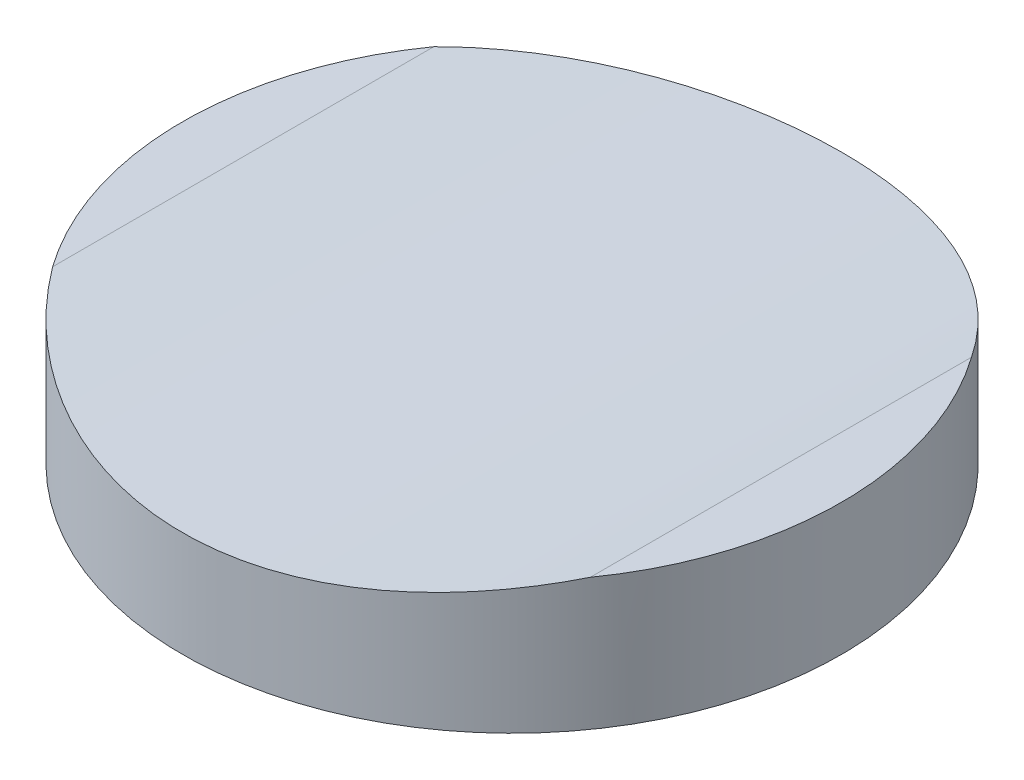
ISO-10303-21;
HEADER;
FILE_DESCRIPTION(('STEP AP214'),'2;1');
FILE_NAME('part.step','',(''),(''),'','','');
FILE_SCHEMA(('AUTOMOTIVE_DESIGN { 1 0 10303 214 1 1 1 1 }'));
ENDSEC;
DATA;
#1=APPLICATION_CONTEXT('core data for automotive mechanical design processes');
#2=APPLICATION_PROTOCOL_DEFINITION('international standard','automotive_design',2000,#1);
#3=PRODUCT_CONTEXT('',#1,'mechanical');
#4=PRODUCT('Part','Part','',(#3));
#5=PRODUCT_RELATED_PRODUCT_CATEGORY('part','',(#4));
#6=PRODUCT_DEFINITION_FORMATION('','',#4);
#7=PRODUCT_DEFINITION_CONTEXT('part definition',#1,'design');
#8=PRODUCT_DEFINITION('design','',#6,#7);
#9=PRODUCT_DEFINITION_SHAPE('','',#8);
#10=(LENGTH_UNIT() NAMED_UNIT(*) SI_UNIT(.MILLI.,.METRE.));
#11=(NAMED_UNIT(*) PLANE_ANGLE_UNIT() SI_UNIT($,.RADIAN.));
#12=(NAMED_UNIT(*) SI_UNIT($,.STERADIAN.) SOLID_ANGLE_UNIT());
#13=UNCERTAINTY_MEASURE_WITH_UNIT(LENGTH_MEASURE(1.E-05),#10,'distance_accuracy_value','');
#14=(GEOMETRIC_REPRESENTATION_CONTEXT(3) GLOBAL_UNCERTAINTY_ASSIGNED_CONTEXT((#13)) GLOBAL_UNIT_ASSIGNED_CONTEXT((#10,
#11,#12)) REPRESENTATION_CONTEXT('',''));
#15=CARTESIAN_POINT('',(0.,0.,0.));
#16=DIRECTION('',(0.,0.,1.));
#17=DIRECTION('',(1.,0.,0.));
#18=AXIS2_PLACEMENT_3D('',#15,#16,#17);
#19=CARTESIAN_POINT('',(0.,10.,0.));
#20=DIRECTION('',(0.,1.,0.));
#21=DIRECTION('',(0.,0.,1.));
#22=AXIS2_PLACEMENT_3D('',#19,#20,#21);
#23=PLANE('',#22);
#24=DIRECTION('',(0.,0.,1.));
#25=VECTOR('',#24,1.);
#26=CARTESIAN_POINT('',(-20.3960780543712,10.,-25.));
#27=LINE('',#26,#25);
#28=CARTESIAN_POINT('',(-20.3960780543712,10.,-14.4568322948009));
#29=VERTEX_POINT('',#28);
#30=CARTESIAN_POINT('',(-20.3960780543712,10.,14.4568322948009));
#31=VERTEX_POINT('',#30);
#32=EDGE_CURVE('E77',#29,#31,#27,.T.);
#33=ORIENTED_EDGE('',*,*,#32,.F.);
#34=CARTESIAN_POINT('',(0.,10.,0.));
#35=DIRECTION('',(0.,-1.,0.));
#36=DIRECTION('',(0.,0.,-1.));
#37=AXIS2_PLACEMENT_3D('',#34,#35,#36);
#38=CIRCLE('',#37,25.);
#39=EDGE_CURVE('E88',#31,#29,#38,.T.);
#40=ORIENTED_EDGE('',*,*,#39,.F.);
#41=EDGE_LOOP('',(#33,#40));
#42=FACE_BOUND('',#41,.T.);
#43=ADVANCED_FACE('F43',(#42),#23,.T.);
#44=DIRECTION('',(0.,0.,1.));
#45=VECTOR('',#44,1.);
#46=CARTESIAN_POINT('',(20.3960780543712,10.,-25.));
#47=LINE('',#46,#45);
#48=CARTESIAN_POINT('',(20.3960780543712,10.,14.4568322948009));
#49=VERTEX_POINT('',#48);
#50=CARTESIAN_POINT('',(20.3960780543712,10.,-14.4568322948009));
#51=VERTEX_POINT('',#50);
#52=EDGE_CURVE('E75',#49,#51,#47,.F.);
#53=ORIENTED_EDGE('',*,*,#52,.F.);
#54=EDGE_CURVE('E80',#51,#49,#38,.T.);
#55=ORIENTED_EDGE('',*,*,#54,.F.);
#56=EDGE_LOOP('',(#53,#55));
#57=FACE_BOUND('',#56,.T.);
#58=ADVANCED_FACE('F45',(#57),#23,.T.);
#59=CARTESIAN_POINT('',(0.,0.,0.));
#60=DIRECTION('',(0.,-1.,0.));
#61=DIRECTION('',(0.,0.,-1.));
#62=AXIS2_PLACEMENT_3D('',#59,#60,#61);
#63=CYLINDRICAL_SURFACE('',#62,25.);
#64=CARTESIAN_POINT('',(20.3960780543712,10.,-14.4568322948009));
#65=CARTESIAN_POINT('',(20.1920503911846,9.95959911281575,-14.7446781618022));
#66=CARTESIAN_POINT('',(19.9819930052799,9.91863289127278,-15.0281165779458));
#67=CARTESIAN_POINT('',(19.5501408897275,9.83585712194446,-15.5857755252584));
#68=CARTESIAN_POINT('',(19.3283462501799,9.7940475806343,-15.8599961271607));
#69=CARTESIAN_POINT('',(18.645947332064,9.66780486400108,-16.6680999628946));
#70=CARTESIAN_POINT('',(18.1682267767202,9.58253732033446,-17.1875680566158));
#71=CARTESIAN_POINT('',(17.1705406637822,9.41221753888684,-18.1843348590653));
#72=CARTESIAN_POINT('',(16.6505664325754,9.32716534902614,-18.6616248675098));
#73=CARTESIAN_POINT('',(15.5718746864125,9.15966810876146,-19.5707473886726));
#74=CARTESIAN_POINT('',(15.0131576238765,9.07722302792929,-20.0025804320669));
#75=CARTESIAN_POINT('',(13.8603439074275,8.91719793775777,-20.8180137523597));
#76=CARTESIAN_POINT('',(13.2662238752028,8.83962121422152,-21.2015816254505));
#77=CARTESIAN_POINT('',(12.0469506314179,8.69157249477392,-21.9173608058878));
#78=CARTESIAN_POINT('',(11.4217971629904,8.62110055768435,-22.2495716880529));
#79=CARTESIAN_POINT('',(10.1450915580882,8.48928909500692,-22.8599540357026));
#80=CARTESIAN_POINT('',(9.49355265114497,8.42794506311971,-23.1381521872149));
#81=CARTESIAN_POINT('',(8.16839588724061,8.31609785600702,-23.6385041044482));
#82=CARTESIAN_POINT('',(7.49477842241998,8.26559448835905,-23.8606588649553));
#83=CARTESIAN_POINT('',(6.13890286498431,8.17743758058123,-24.2446715410227));
#84=CARTESIAN_POINT('',(5.45685892024661,8.13963090569974,-24.4072503597018));
#85=CARTESIAN_POINT('',(4.08094123720568,8.07707526908284,-24.674623770742));
#86=CARTESIAN_POINT('',(3.38706756476047,8.05232623467792,-24.7794186846873));
#87=CARTESIAN_POINT('',(1.9925577555428,8.01659071314542,-24.9303352014276));
#88=CARTESIAN_POINT('',(1.29192107930644,8.00560533319807,-24.9764520840307));
#89=CARTESIAN_POINT('',(-0.110822412069652,7.99771610749899,-25.0095960288059));
#90=CARTESIAN_POINT('',(-0.812929204088387,8.00081204192389,-24.9966240134147));
#91=CARTESIAN_POINT('',(-2.19773369982386,8.02076966313266,-24.9126552064676));
#92=CARTESIAN_POINT('',(-2.88051512183624,8.03732288816366,-24.842958590239));
#93=CARTESIAN_POINT('',(-4.23760396240341,8.08334897134803,-24.6477716600091));
#94=CARTESIAN_POINT('',(-4.91191149664212,8.11282165292988,-24.522282108535));
#95=CARTESIAN_POINT('',(-6.24731461463949,8.18388396986952,-24.2165286340494));
#96=CARTESIAN_POINT('',(-6.90841050287308,8.22547332564213,-24.0362659748911));
#97=CARTESIAN_POINT('',(-8.21286715877759,8.31964618244774,-23.6223844663379));
#98=CARTESIAN_POINT('',(-8.85622795999666,8.37222966268235,-23.3887657178806));
#99=CARTESIAN_POINT('',(-10.1238505237533,8.4872514752035,-22.8687377921397));
#100=CARTESIAN_POINT('',(-10.7480095034725,8.54973451842366,-22.5820880672472));
#101=CARTESIAN_POINT('',(-11.9699985782538,8.68271027051106,-21.9588157044504));
#102=CARTESIAN_POINT('',(-12.5678273127025,8.75320339262621,-21.622190487986));
#103=CARTESIAN_POINT('',(-13.7331689142019,8.90031212190214,-20.9014217464896));
#104=CARTESIAN_POINT('',(-14.3006864898632,8.97692677348699,-20.5172856328389));
#105=CARTESIAN_POINT('',(-15.4018559229656,9.13425925559841,-19.7040889615662));
#106=CARTESIAN_POINT('',(-15.9355139310939,9.21497633608145,-19.2750366008496));
#107=CARTESIAN_POINT('',(-16.8210658653765,9.35545059920659,-18.5011888867841));
#108=CARTESIAN_POINT('',(-17.1819498551212,9.41473486645571,-18.1665259227072));
#109=CARTESIAN_POINT('',(-17.8833258590057,9.53351691803282,-17.4765160223632));
#110=CARTESIAN_POINT('',(-18.2238191259532,9.59301468900456,-17.1211703594937));
#111=CARTESIAN_POINT('',(-18.8827585363334,9.71131072061597,-16.391542077919));
#112=CARTESIAN_POINT('',(-19.2012391951431,9.77010995086852,-16.0172907749832));
#113=CARTESIAN_POINT('',(-19.8157664353491,9.88630940841203,-15.2504765214829));
#114=CARTESIAN_POINT('',(-20.1118087216309,9.9437093664374,-14.8579100881848));
#115=CARTESIAN_POINT('',(-20.3960780543712,10.,-14.4568322948009));
#116=B_SPLINE_CURVE_WITH_KNOTS('',3,(#64,#65,#66,#67,#68,#69,#70,#71,#72,#73,#74,#75,#76,#77,
#78,#79,#80,#81,#82,#83,#84,#85,#86,#87,#88,#89,#90,#91,#92,#93,#94,#95,#96,#97,#98,#99,#100,
#101,#102,#103,#104,#105,#106,#107,#108,#109,#110,#111,#112,#113,#114,#115),.UNSPECIFIED.,.F.,
.F.,(4,2,2,2,2,2,2,2,2,2,2,2,2,2,2,2,2,2,2,2,2,2,2,2,2,4),(0.,1.06521316417547,2.13041815252273,
4.26030103122388,6.39062223093138,8.52091855796986,10.6526375574396,12.7843742043357,
14.9150549304999,17.0456978338182,19.1496335758205,21.2535576086913,23.3576508752151,
25.4617112948554,27.5188593543691,29.5759792995105,31.6330517815722,33.6901203721556,
35.7567593521573,37.823505000564,39.88992865618,41.9559758589465,43.4423841490786,
44.9287010202706,46.4126318660788,47.8968460497268),.UNSPECIFIED.);
#117=EDGE_CURVE('E11',#51,#29,#116,.T.);
#118=ORIENTED_EDGE('',*,*,#117,.F.);
#119=ORIENTED_EDGE('',*,*,#54,.T.);
#120=CARTESIAN_POINT('',(-20.3960780543712,10.,14.4568322948009));
#121=CARTESIAN_POINT('',(-20.1920503911846,9.95959911281575,14.7446781618022));
#122=CARTESIAN_POINT('',(-19.9819930052799,9.91863289127278,15.0281165779458));
#123=CARTESIAN_POINT('',(-19.5501408897275,9.83585712194446,15.5857755252584));
#124=CARTESIAN_POINT('',(-19.3283462501799,9.7940475806343,15.8599961271607));
#125=CARTESIAN_POINT('',(-18.645947332064,9.66780486400108,16.6680999628946));
#126=CARTESIAN_POINT('',(-18.1682267767202,9.58253732033446,17.1875680566158));
#127=CARTESIAN_POINT('',(-17.1705406637822,9.41221753888684,18.1843348590653));
#128=CARTESIAN_POINT('',(-16.6505664325754,9.32716534902614,18.6616248675098));
#129=CARTESIAN_POINT('',(-15.5718746864125,9.15966810876146,19.5707473886726));
#130=CARTESIAN_POINT('',(-15.0131576238765,9.07722302792929,20.0025804320669));
#131=CARTESIAN_POINT('',(-13.8603439074275,8.91719793775777,20.8180137523597));
#132=CARTESIAN_POINT('',(-13.2662238752028,8.83962121422152,21.2015816254505));
#133=CARTESIAN_POINT('',(-12.0469506314179,8.69157249477392,21.9173608058878));
#134=CARTESIAN_POINT('',(-11.4217971629904,8.62110055768435,22.2495716880529));
#135=CARTESIAN_POINT('',(-10.1450915580882,8.48928909500692,22.8599540357026));
#136=CARTESIAN_POINT('',(-9.49355265114497,8.42794506311971,23.1381521872149));
#137=CARTESIAN_POINT('',(-8.16839588724061,8.31609785600702,23.6385041044482));
#138=CARTESIAN_POINT('',(-7.49477842241998,8.26559448835905,23.8606588649553));
#139=CARTESIAN_POINT('',(-6.13890286498431,8.17743758058123,24.2446715410227));
#140=CARTESIAN_POINT('',(-5.45685892024661,8.13963090569974,24.4072503597018));
#141=CARTESIAN_POINT('',(-4.08094123720568,8.07707526908284,24.674623770742));
#142=CARTESIAN_POINT('',(-3.38706756476047,8.05232623467792,24.7794186846873));
#143=CARTESIAN_POINT('',(-1.9925577555428,8.01659071314542,24.9303352014276));
#144=CARTESIAN_POINT('',(-1.29192107930644,8.00560533319807,24.9764520840307));
#145=CARTESIAN_POINT('',(0.110822412069652,7.99771610749899,25.0095960288059));
#146=CARTESIAN_POINT('',(0.812929204088387,8.00081204192389,24.9966240134147));
#147=CARTESIAN_POINT('',(2.19773369982386,8.02076966313266,24.9126552064676));
#148=CARTESIAN_POINT('',(2.88051512183624,8.03732288816366,24.842958590239));
#149=CARTESIAN_POINT('',(4.23760396240341,8.08334897134803,24.6477716600091));
#150=CARTESIAN_POINT('',(4.91191149664212,8.11282165292988,24.522282108535));
#151=CARTESIAN_POINT('',(6.24731461463949,8.18388396986952,24.2165286340494));
#152=CARTESIAN_POINT('',(6.90841050287308,8.22547332564213,24.0362659748911));
#153=CARTESIAN_POINT('',(8.21286715877759,8.31964618244774,23.6223844663379));
#154=CARTESIAN_POINT('',(8.85622795999666,8.37222966268235,23.3887657178806));
#155=CARTESIAN_POINT('',(10.1238505237533,8.4872514752035,22.8687377921397));
#156=CARTESIAN_POINT('',(10.7480095034725,8.54973451842366,22.5820880672472));
#157=CARTESIAN_POINT('',(11.9699985782538,8.68271027051106,21.9588157044504));
#158=CARTESIAN_POINT('',(12.5678273127025,8.75320339262621,21.622190487986));
#159=CARTESIAN_POINT('',(13.7331689142019,8.90031212190214,20.9014217464896));
#160=CARTESIAN_POINT('',(14.3006864898632,8.97692677348699,20.5172856328389));
#161=CARTESIAN_POINT('',(15.4018559229656,9.13425925559841,19.7040889615662));
#162=CARTESIAN_POINT('',(15.9355139310939,9.21497633608145,19.2750366008496));
#163=CARTESIAN_POINT('',(16.8210658653765,9.35545059920659,18.5011888867841));
#164=CARTESIAN_POINT('',(17.1819498551212,9.41473486645571,18.1665259227072));
#165=CARTESIAN_POINT('',(17.8833258590057,9.53351691803282,17.4765160223632));
#166=CARTESIAN_POINT('',(18.2238191259532,9.59301468900456,17.1211703594937));
#167=CARTESIAN_POINT('',(18.8827585363334,9.71131072061597,16.391542077919));
#168=CARTESIAN_POINT('',(19.2012391951431,9.77010995086852,16.0172907749832));
#169=CARTESIAN_POINT('',(19.8157664353491,9.88630940841203,15.2504765214829));
#170=CARTESIAN_POINT('',(20.1118087216309,9.9437093664374,14.8579100881848));
#171=CARTESIAN_POINT('',(20.3960780543712,10.,14.4568322948009));
#172=B_SPLINE_CURVE_WITH_KNOTS('',3,(#120,#121,#122,#123,#124,#125,#126,#127,#128,#129,#130,
#131,#132,#133,#134,#135,#136,#137,#138,#139,#140,#141,#142,#143,#144,#145,#146,#147,#148,#149,
#150,#151,#152,#153,#154,#155,#156,#157,#158,#159,#160,#161,#162,#163,#164,#165,#166,#167,#168,
#169,#170,#171),.UNSPECIFIED.,.F.,.F.,(4,2,2,2,2,2,2,2,2,2,2,2,2,2,2,2,2,2,2,2,2,2,2,2,2,4),(0.,
1.06521316417547,2.13041815252273,4.26030103122388,6.39062223093138,8.52091855796986,
10.6526375574396,12.7843742043357,14.9150549304999,17.0456978338182,19.1496335758205,
21.2535576086913,23.3576508752151,25.4617112948554,27.5188593543691,29.5759792995105,
31.6330517815722,33.6901203721556,35.7567593521573,37.823505000564,39.88992865618,
41.9559758589465,43.4423841490786,44.9287010202706,46.4126318660788,47.8968460497268),.UNSPECIFIED.);
#173=EDGE_CURVE('E57',#31,#49,#172,.T.);
#174=ORIENTED_EDGE('',*,*,#173,.F.);
#175=ORIENTED_EDGE('',*,*,#39,.T.);
#176=EDGE_LOOP('',(#118,#119,#174,#175));
#177=FACE_BOUND('',#176,.T.);
#178=CARTESIAN_POINT('',(0.,0.,0.));
#179=DIRECTION('',(0.,-1.,0.));
#180=DIRECTION('',(0.,0.,-1.));
#181=AXIS2_PLACEMENT_3D('',#178,#179,#180);
#182=CIRCLE('',#181,25.);
#183=CARTESIAN_POINT('',(0.,0.,-25.));
#184=VERTEX_POINT('',#183);
#185=EDGE_CURVE('E91',#184,#184,#182,.T.);
#186=ORIENTED_EDGE('',*,*,#185,.F.);
#187=EDGE_LOOP('',(#186));
#188=FACE_BOUND('',#187,.T.);
#189=ADVANCED_FACE('F85',(#177,#188),#63,.T.);
#190=CARTESIAN_POINT('',(25.,0.,0.));
#191=DIRECTION('',(0.,-1.,0.));
#192=DIRECTION('',(0.,0.,-1.));
#193=AXIS2_PLACEMENT_3D('',#190,#191,#192);
#194=PLANE('',#193);
#195=CARTESIAN_POINT('',(-17.,0.,0.));
#196=DIRECTION('',(0.,-1.,0.));
#197=DIRECTION('',(0.,0.,-1.));
#198=AXIS2_PLACEMENT_3D('',#195,#196,#197);
#199=CIRCLE('',#198,1.49999999999999);
#200=CARTESIAN_POINT('',(-17.,0.,-1.49999999999999));
#201=VERTEX_POINT('',#200);
#202=EDGE_CURVE('E126',#201,#201,#199,.T.);
#203=ORIENTED_EDGE('',*,*,#202,.F.);
#204=EDGE_LOOP('',(#203));
#205=FACE_BOUND('',#204,.T.);
#206=ORIENTED_EDGE('',*,*,#185,.T.);
#207=EDGE_LOOP('',(#206));
#208=FACE_BOUND('',#207,.T.);
#209=ADVANCED_FACE('F104',(#205,#208),#194,.T.);
#210=CARTESIAN_POINT('',(0.,113.,-25.));
#211=DIRECTION('',(0.,0.,1.));
#212=DIRECTION('',(1.,0.,0.));
#213=AXIS2_PLACEMENT_3D('',#210,#211,#212);
#214=CYLINDRICAL_SURFACE('',#213,105.);
#215=ORIENTED_EDGE('',*,*,#52,.T.);
#216=ORIENTED_EDGE('',*,*,#117,.T.);
#217=ORIENTED_EDGE('',*,*,#32,.T.);
#218=ORIENTED_EDGE('',*,*,#173,.T.);
#219=EDGE_LOOP('',(#215,#216,#217,#218));
#220=FACE_BOUND('',#219,.T.);
#221=ADVANCED_FACE('F74',(#220),#214,.F.);
#222=CARTESIAN_POINT('',(-17.,6.,0.));
#223=DIRECTION('',(0.,1.,0.));
#224=DIRECTION('',(0.,0.,1.));
#225=AXIS2_PLACEMENT_3D('',#222,#223,#224);
#226=PLANE('',#225);
#227=CARTESIAN_POINT('',(-17.,6.,0.));
#228=DIRECTION('',(0.,-1.,0.));
#229=DIRECTION('',(0.,0.,-1.));
#230=AXIS2_PLACEMENT_3D('',#227,#228,#229);
#231=CIRCLE('',#230,1.5);
#232=CARTESIAN_POINT('',(-17.,6.,-1.5));
#233=VERTEX_POINT('',#232);
#234=EDGE_CURVE('E83',#233,#233,#231,.T.);
#235=ORIENTED_EDGE('',*,*,#234,.T.);
#236=EDGE_LOOP('',(#235));
#237=FACE_BOUND('',#236,.T.);
#238=ADVANCED_FACE('F103',(#237),#226,.F.);
#239=CARTESIAN_POINT('',(-17.,0.,0.));
#240=DIRECTION('',(0.,-1.,0.));
#241=DIRECTION('',(0.,0.,-1.));
#242=AXIS2_PLACEMENT_3D('',#239,#240,#241);
#243=CYLINDRICAL_SURFACE('',#242,1.49999999999999);
#244=ORIENTED_EDGE('',*,*,#234,.F.);
#245=EDGE_LOOP('',(#244));
#246=FACE_BOUND('',#245,.T.);
#247=ORIENTED_EDGE('',*,*,#202,.T.);
#248=EDGE_LOOP('',(#247));
#249=FACE_BOUND('',#248,.T.);
#250=ADVANCED_FACE('F130',(#246,#249),#243,.F.);
#251=CLOSED_SHELL('',(#43,#58,#189,#209,#221,#238,#250));
#252=MANIFOLD_SOLID_BREP('B2',#251);
#253=ADVANCED_BREP_SHAPE_REPRESENTATION('',(#18,#252),#14);
#254=SHAPE_DEFINITION_REPRESENTATION(#9,#253);
ENDSEC;
END-ISO-10303-21;
